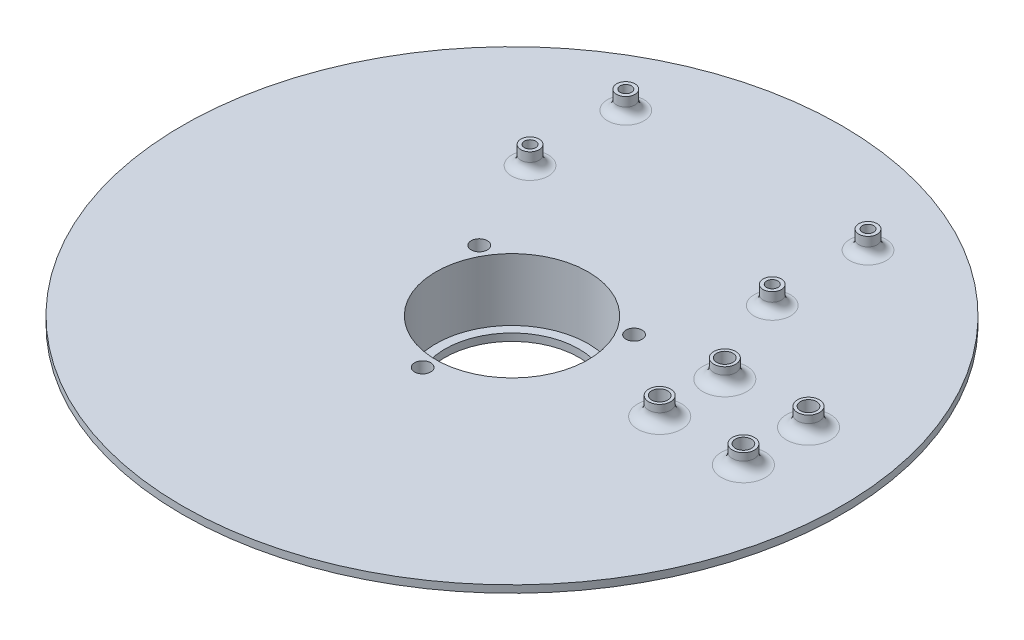
ISO-10303-21;
HEADER;
FILE_DESCRIPTION(('STEP AP214'),'2;1');
FILE_NAME('part.step','',(''),(''),'','','');
FILE_SCHEMA(('AUTOMOTIVE_DESIGN { 1 0 10303 214 1 1 1 1 }'));
ENDSEC;
DATA;
#1=APPLICATION_CONTEXT('core data for automotive mechanical design processes');
#2=APPLICATION_PROTOCOL_DEFINITION('international standard','automotive_design',2000,#1);
#3=PRODUCT_CONTEXT('',#1,'mechanical');
#4=PRODUCT('Part','Part','',(#3));
#5=PRODUCT_RELATED_PRODUCT_CATEGORY('part','',(#4));
#6=PRODUCT_DEFINITION_FORMATION('','',#4);
#7=PRODUCT_DEFINITION_CONTEXT('part definition',#1,'design');
#8=PRODUCT_DEFINITION('design','',#6,#7);
#9=PRODUCT_DEFINITION_SHAPE('','',#8);
#10=(LENGTH_UNIT() NAMED_UNIT(*) SI_UNIT(.MILLI.,.METRE.));
#11=(NAMED_UNIT(*) PLANE_ANGLE_UNIT() SI_UNIT($,.RADIAN.));
#12=(NAMED_UNIT(*) SI_UNIT($,.STERADIAN.) SOLID_ANGLE_UNIT());
#13=UNCERTAINTY_MEASURE_WITH_UNIT(LENGTH_MEASURE(1.E-05),#10,'distance_accuracy_value','');
#14=(GEOMETRIC_REPRESENTATION_CONTEXT(3) GLOBAL_UNCERTAINTY_ASSIGNED_CONTEXT((#13)) GLOBAL_UNIT_ASSIGNED_CONTEXT((#10,
#11,#12)) REPRESENTATION_CONTEXT('',''));
#15=CARTESIAN_POINT('',(0.,0.,0.));
#16=DIRECTION('',(0.,0.,1.));
#17=DIRECTION('',(1.,0.,0.));
#18=AXIS2_PLACEMENT_3D('',#15,#16,#17);
#19=CARTESIAN_POINT('',(0.,2.,0.));
#20=DIRECTION('',(0.,-1.,0.));
#21=DIRECTION('',(0.,0.,-1.));
#22=AXIS2_PLACEMENT_3D('',#19,#20,#21);
#23=CYLINDRICAL_SURFACE('',#22,20.8);
#24=CARTESIAN_POINT('',(0.,2.,0.));
#25=DIRECTION('',(0.,-1.,0.));
#26=DIRECTION('',(0.,0.,-1.));
#27=AXIS2_PLACEMENT_3D('',#24,#25,#26);
#28=CIRCLE('',#27,20.8);
#29=CARTESIAN_POINT('',(0.,2.,-20.8));
#30=VERTEX_POINT('',#29);
#31=EDGE_CURVE('E112',#30,#30,#28,.T.);
#32=ORIENTED_EDGE('',*,*,#31,.F.);
#33=EDGE_LOOP('',(#32));
#34=FACE_BOUND('',#33,.T.);
#35=CARTESIAN_POINT('',(0.,-15.,0.));
#36=DIRECTION('',(0.,-1.,0.));
#37=DIRECTION('',(0.,0.,-1.));
#38=AXIS2_PLACEMENT_3D('',#35,#36,#37);
#39=CIRCLE('',#38,20.8);
#40=CARTESIAN_POINT('',(0.,-15.,-20.8));
#41=VERTEX_POINT('',#40);
#42=EDGE_CURVE('E97',#41,#41,#39,.F.);
#43=ORIENTED_EDGE('',*,*,#42,.F.);
#44=EDGE_LOOP('',(#43));
#45=FACE_BOUND('',#44,.T.);
#46=ADVANCED_FACE('F41',(#34,#45),#23,.F.);
#47=CARTESIAN_POINT('',(0.,2.,0.));
#48=DIRECTION('',(0.,-1.,0.));
#49=DIRECTION('',(0.,0.,-1.));
#50=AXIS2_PLACEMENT_3D('',#47,#48,#49);
#51=CYLINDRICAL_SURFACE('',#50,90.);
#52=CARTESIAN_POINT('',(0.,2.,0.));
#53=DIRECTION('',(0.,1.,0.));
#54=DIRECTION('',(0.,0.,1.));
#55=AXIS2_PLACEMENT_3D('',#52,#53,#54);
#56=CIRCLE('',#55,90.);
#57=CARTESIAN_POINT('',(0.,2.,90.));
#58=VERTEX_POINT('',#57);
#59=EDGE_CURVE('E104',#58,#58,#56,.T.);
#60=ORIENTED_EDGE('',*,*,#59,.F.);
#61=EDGE_LOOP('',(#60));
#62=FACE_BOUND('',#61,.T.);
#63=CARTESIAN_POINT('',(0.,0.,0.));
#64=DIRECTION('',(0.,1.,0.));
#65=DIRECTION('',(0.,0.,1.));
#66=AXIS2_PLACEMENT_3D('',#63,#64,#65);
#67=CIRCLE('',#66,90.);
#68=CARTESIAN_POINT('',(0.,0.,90.));
#69=VERTEX_POINT('',#68);
#70=EDGE_CURVE('E101',#69,#69,#67,.T.);
#71=ORIENTED_EDGE('',*,*,#70,.T.);
#72=EDGE_LOOP('',(#71));
#73=FACE_BOUND('',#72,.T.);
#74=ADVANCED_FACE('F235',(#62,#73),#51,.T.);
#75=CARTESIAN_POINT('',(0.,2.,0.));
#76=DIRECTION('',(0.,1.,0.));
#77=DIRECTION('',(0.,0.,1.));
#78=AXIS2_PLACEMENT_3D('',#75,#76,#77);
#79=PLANE('',#78);
#80=CARTESIAN_POINT('',(66.86,2.,3.667));
#81=DIRECTION('',(0.,1.,0.));
#82=DIRECTION('',(0.,0.,1.));
#83=AXIS2_PLACEMENT_3D('',#80,#81,#82);
#84=CIRCLE('',#83,6.00000000000001);
#85=CARTESIAN_POINT('',(66.86,2.,9.66700000000001));
#86=VERTEX_POINT('',#85);
#87=EDGE_CURVE('E56',#86,#86,#84,.F.);
#88=ORIENTED_EDGE('',*,*,#87,.T.);
#89=EDGE_LOOP('',(#88));
#90=FACE_BOUND('',#89,.T.);
#91=CARTESIAN_POINT('',(66.86,2.,-14.113));
#92=DIRECTION('',(0.,1.,0.));
#93=DIRECTION('',(0.,0.,1.));
#94=AXIS2_PLACEMENT_3D('',#91,#92,#93);
#95=CIRCLE('',#94,6.00000000000001);
#96=CARTESIAN_POINT('',(66.86,2.,-8.113));
#97=VERTEX_POINT('',#96);
#98=EDGE_CURVE('E61',#97,#97,#95,.F.);
#99=ORIENTED_EDGE('',*,*,#98,.T.);
#100=EDGE_LOOP('',(#99));
#101=FACE_BOUND('',#100,.T.);
#102=CARTESIAN_POINT('',(44.,2.,-14.113));
#103=DIRECTION('',(0.,1.,0.));
#104=DIRECTION('',(0.,0.,1.));
#105=AXIS2_PLACEMENT_3D('',#102,#103,#104);
#106=CIRCLE('',#105,6.);
#107=CARTESIAN_POINT('',(44.,2.,-8.113));
#108=VERTEX_POINT('',#107);
#109=EDGE_CURVE('E64',#108,#108,#106,.F.);
#110=ORIENTED_EDGE('',*,*,#109,.T.);
#111=EDGE_LOOP('',(#110));
#112=FACE_BOUND('',#111,.T.);
#113=CARTESIAN_POINT('',(44.,2.,3.667));
#114=DIRECTION('',(0.,1.,0.));
#115=DIRECTION('',(0.,0.,1.));
#116=AXIS2_PLACEMENT_3D('',#113,#114,#115);
#117=CIRCLE('',#116,6.);
#118=CARTESIAN_POINT('',(44.,2.,9.667));
#119=VERTEX_POINT('',#118);
#120=EDGE_CURVE('E67',#119,#119,#117,.F.);
#121=ORIENTED_EDGE('',*,*,#120,.T.);
#122=EDGE_LOOP('',(#121));
#123=FACE_BOUND('',#122,.T.);
#124=CARTESIAN_POINT('',(-33.075,2.,-64.15));
#125=DIRECTION('',(0.,1.,0.));
#126=DIRECTION('',(0.,0.,1.));
#127=AXIS2_PLACEMENT_3D('',#124,#125,#126);
#128=CIRCLE('',#127,5.);
#129=CARTESIAN_POINT('',(-33.075,2.,-59.15));
#130=VERTEX_POINT('',#129);
#131=EDGE_CURVE('E82',#130,#130,#128,.F.);
#132=ORIENTED_EDGE('',*,*,#131,.T.);
#133=EDGE_LOOP('',(#132));
#134=FACE_BOUND('',#133,.T.);
#135=CARTESIAN_POINT('',(-33.075,2.,-38.));
#136=DIRECTION('',(0.,1.,0.));
#137=DIRECTION('',(0.,0.,1.));
#138=AXIS2_PLACEMENT_3D('',#135,#136,#137);
#139=CIRCLE('',#138,5.);
#140=CARTESIAN_POINT('',(-33.075,2.,-33.));
#141=VERTEX_POINT('',#140);
#142=EDGE_CURVE('E85',#141,#141,#139,.F.);
#143=ORIENTED_EDGE('',*,*,#142,.T.);
#144=EDGE_LOOP('',(#143));
#145=FACE_BOUND('',#144,.T.);
#146=CARTESIAN_POINT('',(33.075,2.,-64.15));
#147=DIRECTION('',(0.,1.,0.));
#148=DIRECTION('',(0.,0.,1.));
#149=AXIS2_PLACEMENT_3D('',#146,#147,#148);
#150=CIRCLE('',#149,5.);
#151=CARTESIAN_POINT('',(33.075,2.,-59.15));
#152=VERTEX_POINT('',#151);
#153=EDGE_CURVE('E88',#152,#152,#150,.F.);
#154=ORIENTED_EDGE('',*,*,#153,.T.);
#155=EDGE_LOOP('',(#154));
#156=FACE_BOUND('',#155,.T.);
#157=CARTESIAN_POINT('',(33.075,2.,-38.));
#158=DIRECTION('',(0.,1.,0.));
#159=DIRECTION('',(0.,0.,1.));
#160=AXIS2_PLACEMENT_3D('',#157,#158,#159);
#161=CIRCLE('',#160,5.);
#162=CARTESIAN_POINT('',(33.075,2.,-33.));
#163=VERTEX_POINT('',#162);
#164=EDGE_CURVE('E91',#163,#163,#161,.F.);
#165=ORIENTED_EDGE('',*,*,#164,.T.);
#166=EDGE_LOOP('',(#165));
#167=FACE_BOUND('',#166,.T.);
#168=CARTESIAN_POINT('',(0.,2.,24.4));
#169=DIRECTION('',(0.,1.,0.));
#170=DIRECTION('',(0.,0.,1.));
#171=AXIS2_PLACEMENT_3D('',#168,#169,#170);
#172=CIRCLE('',#171,2.2);
#173=CARTESIAN_POINT('',(0.,2.,26.6));
#174=VERTEX_POINT('',#173);
#175=EDGE_CURVE('E135',#174,#174,#172,.T.);
#176=ORIENTED_EDGE('',*,*,#175,.F.);
#177=EDGE_LOOP('',(#176));
#178=FACE_BOUND('',#177,.T.);
#179=CARTESIAN_POINT('',(-21.1310198523402,2.,-12.2000000000001));
#180=DIRECTION('',(0.,1.,0.));
#181=DIRECTION('',(0.,0.,1.));
#182=AXIS2_PLACEMENT_3D('',#179,#180,#181);
#183=CIRCLE('',#182,2.2);
#184=CARTESIAN_POINT('',(-21.1310198523402,2.,-10.0000000000001));
#185=VERTEX_POINT('',#184);
#186=EDGE_CURVE('E132',#185,#185,#183,.T.);
#187=ORIENTED_EDGE('',*,*,#186,.F.);
#188=EDGE_LOOP('',(#187));
#189=FACE_BOUND('',#188,.T.);
#190=CARTESIAN_POINT('',(21.1310198523404,2.,-12.1999999999998));
#191=DIRECTION('',(0.,1.,0.));
#192=DIRECTION('',(0.,0.,1.));
#193=AXIS2_PLACEMENT_3D('',#190,#191,#192);
#194=CIRCLE('',#193,2.2);
#195=CARTESIAN_POINT('',(21.1310198523404,2.,-9.9999999999998));
#196=VERTEX_POINT('',#195);
#197=EDGE_CURVE('E125',#196,#196,#194,.T.);
#198=ORIENTED_EDGE('',*,*,#197,.F.);
#199=EDGE_LOOP('',(#198));
#200=FACE_BOUND('',#199,.T.);
#201=ORIENTED_EDGE('',*,*,#31,.T.);
#202=EDGE_LOOP('',(#201));
#203=FACE_BOUND('',#202,.T.);
#204=ORIENTED_EDGE('',*,*,#59,.T.);
#205=EDGE_LOOP('',(#204));
#206=FACE_BOUND('',#205,.T.);
#207=ADVANCED_FACE('F243',(#90,#101,#112,#123,#134,#145,#156,#167,#178,#189,#200,#203,#206),#79,.T.);
#208=CARTESIAN_POINT('',(0.,0.,0.));
#209=DIRECTION('',(0.,1.,0.));
#210=DIRECTION('',(0.,0.,1.));
#211=AXIS2_PLACEMENT_3D('',#208,#209,#210);
#212=PLANE('',#211);
#213=CARTESIAN_POINT('',(0.,0.,0.));
#214=DIRECTION('',(0.,-1.,0.));
#215=DIRECTION('',(0.,0.,-1.));
#216=AXIS2_PLACEMENT_3D('',#213,#214,#215);
#217=CIRCLE('',#216,28.);
#218=CARTESIAN_POINT('',(0.,0.,-28.));
#219=VERTEX_POINT('',#218);
#220=EDGE_CURVE('E100',#219,#219,#217,.T.);
#221=ORIENTED_EDGE('',*,*,#220,.F.);
#222=EDGE_LOOP('',(#221));
#223=FACE_BOUND('',#222,.T.);
#224=ORIENTED_EDGE('',*,*,#70,.F.);
#225=EDGE_LOOP('',(#224));
#226=FACE_BOUND('',#225,.T.);
#227=ADVANCED_FACE('F258',(#223,#226),#212,.F.);
#228=CARTESIAN_POINT('',(0.,-17.,0.));
#229=DIRECTION('',(0.,1.,0.));
#230=DIRECTION('',(0.,0.,1.));
#231=AXIS2_PLACEMENT_3D('',#228,#229,#230);
#232=CYLINDRICAL_SURFACE('',#231,28.);
#233=CARTESIAN_POINT('',(0.,-17.,0.));
#234=DIRECTION('',(0.,-1.,0.));
#235=DIRECTION('',(0.,0.,-1.));
#236=AXIS2_PLACEMENT_3D('',#233,#234,#235);
#237=CIRCLE('',#236,28.);
#238=CARTESIAN_POINT('',(0.,-17.,-28.));
#239=VERTEX_POINT('',#238);
#240=EDGE_CURVE('E105',#239,#239,#237,.T.);
#241=ORIENTED_EDGE('',*,*,#240,.F.);
#242=EDGE_LOOP('',(#241));
#243=FACE_BOUND('',#242,.T.);
#244=ORIENTED_EDGE('',*,*,#220,.T.);
#245=EDGE_LOOP('',(#244));
#246=FACE_BOUND('',#245,.T.);
#247=ADVANCED_FACE('F255',(#243,#246),#232,.T.);
#248=CARTESIAN_POINT('',(0.,-17.,0.));
#249=DIRECTION('',(0.,-1.,0.));
#250=DIRECTION('',(0.,0.,-1.));
#251=AXIS2_PLACEMENT_3D('',#248,#249,#250);
#252=PLANE('',#251);
#253=CARTESIAN_POINT('',(0.,-17.,0.));
#254=DIRECTION('',(0.,-1.,0.));
#255=DIRECTION('',(0.,0.,-1.));
#256=AXIS2_PLACEMENT_3D('',#253,#254,#255);
#257=CIRCLE('',#256,18.3);
#258=CARTESIAN_POINT('',(0.,-17.,-18.3));
#259=VERTEX_POINT('',#258);
#260=EDGE_CURVE('E116',#259,#259,#257,.T.);
#261=ORIENTED_EDGE('',*,*,#260,.F.);
#262=EDGE_LOOP('',(#261));
#263=FACE_BOUND('',#262,.T.);
#264=ORIENTED_EDGE('',*,*,#240,.T.);
#265=EDGE_LOOP('',(#264));
#266=FACE_BOUND('',#265,.T.);
#267=ADVANCED_FACE('F252',(#263,#266),#252,.T.);
#268=CARTESIAN_POINT('',(0.,-15.,0.));
#269=DIRECTION('',(0.,-1.,0.));
#270=DIRECTION('',(0.,0.,-1.));
#271=AXIS2_PLACEMENT_3D('',#268,#269,#270);
#272=PLANE('',#271);
#273=CARTESIAN_POINT('',(0.,-15.,0.));
#274=DIRECTION('',(0.,-1.,0.));
#275=DIRECTION('',(0.,0.,-1.));
#276=AXIS2_PLACEMENT_3D('',#273,#274,#275);
#277=CIRCLE('',#276,18.3);
#278=CARTESIAN_POINT('',(0.,-15.,-18.3));
#279=VERTEX_POINT('',#278);
#280=EDGE_CURVE('E115',#279,#279,#277,.T.);
#281=ORIENTED_EDGE('',*,*,#280,.T.);
#282=EDGE_LOOP('',(#281));
#283=FACE_BOUND('',#282,.T.);
#284=ORIENTED_EDGE('',*,*,#42,.T.);
#285=EDGE_LOOP('',(#284));
#286=FACE_BOUND('',#285,.T.);
#287=ADVANCED_FACE('F250',(#283,#286),#272,.F.);
#288=CARTESIAN_POINT('',(0.,-15.,0.));
#289=DIRECTION('',(0.,-1.,0.));
#290=DIRECTION('',(0.,0.,-1.));
#291=AXIS2_PLACEMENT_3D('',#288,#289,#290);
#292=CYLINDRICAL_SURFACE('',#291,18.3);
#293=ORIENTED_EDGE('',*,*,#280,.F.);
#294=EDGE_LOOP('',(#293));
#295=FACE_BOUND('',#294,.T.);
#296=ORIENTED_EDGE('',*,*,#260,.T.);
#297=EDGE_LOOP('',(#296));
#298=FACE_BOUND('',#297,.T.);
#299=ADVANCED_FACE('F326',(#295,#298),#292,.F.);
#300=CARTESIAN_POINT('',(21.1310198523404,-4.,-12.1999999999998));
#301=DIRECTION('',(0.,1.,0.));
#302=DIRECTION('',(0.,0.,1.));
#303=AXIS2_PLACEMENT_3D('',#300,#301,#302);
#304=CYLINDRICAL_SURFACE('',#303,2.2);
#305=CARTESIAN_POINT('',(21.1310198523404,-4.,-12.1999999999998));
#306=DIRECTION('',(0.,1.,0.));
#307=DIRECTION('',(0.,0.,1.));
#308=AXIS2_PLACEMENT_3D('',#305,#306,#307);
#309=CIRCLE('',#308,2.2);
#310=CARTESIAN_POINT('',(21.1310198523404,-4.,-9.9999999999998));
#311=VERTEX_POINT('',#310);
#312=EDGE_CURVE('E122',#311,#311,#309,.T.);
#313=ORIENTED_EDGE('',*,*,#312,.F.);
#314=EDGE_LOOP('',(#313));
#315=FACE_BOUND('',#314,.T.);
#316=ORIENTED_EDGE('',*,*,#197,.T.);
#317=EDGE_LOOP('',(#316));
#318=FACE_BOUND('',#317,.T.);
#319=ADVANCED_FACE('F323',(#315,#318),#304,.F.);
#320=CARTESIAN_POINT('',(21.1310198523404,-4.,-12.1999999999998));
#321=DIRECTION('',(0.,1.,0.));
#322=DIRECTION('',(0.,0.,1.));
#323=AXIS2_PLACEMENT_3D('',#320,#321,#322);
#324=PLANE('',#323);
#325=ORIENTED_EDGE('',*,*,#312,.T.);
#326=EDGE_LOOP('',(#325));
#327=FACE_BOUND('',#326,.T.);
#328=ADVANCED_FACE('F325',(#327),#324,.T.);
#329=CARTESIAN_POINT('',(-21.1310198523402,-4.,-12.2000000000001));
#330=DIRECTION('',(0.,1.,0.));
#331=DIRECTION('',(0.,0.,1.));
#332=AXIS2_PLACEMENT_3D('',#329,#330,#331);
#333=CYLINDRICAL_SURFACE('',#332,2.2);
#334=CARTESIAN_POINT('',(-21.1310198523402,-4.,-12.2000000000001));
#335=DIRECTION('',(0.,1.,0.));
#336=DIRECTION('',(0.,0.,1.));
#337=AXIS2_PLACEMENT_3D('',#334,#335,#336);
#338=CIRCLE('',#337,2.2);
#339=CARTESIAN_POINT('',(-21.1310198523402,-4.,-10.0000000000001));
#340=VERTEX_POINT('',#339);
#341=EDGE_CURVE('E129',#340,#340,#338,.T.);
#342=ORIENTED_EDGE('',*,*,#341,.F.);
#343=EDGE_LOOP('',(#342));
#344=FACE_BOUND('',#343,.T.);
#345=ORIENTED_EDGE('',*,*,#186,.T.);
#346=EDGE_LOOP('',(#345));
#347=FACE_BOUND('',#346,.T.);
#348=ADVANCED_FACE('F333',(#344,#347),#333,.F.);
#349=CARTESIAN_POINT('',(-21.1310198523402,-4.,-12.2000000000001));
#350=DIRECTION('',(0.,1.,0.));
#351=DIRECTION('',(0.,0.,1.));
#352=AXIS2_PLACEMENT_3D('',#349,#350,#351);
#353=PLANE('',#352);
#354=ORIENTED_EDGE('',*,*,#341,.T.);
#355=EDGE_LOOP('',(#354));
#356=FACE_BOUND('',#355,.T.);
#357=ADVANCED_FACE('F339',(#356),#353,.T.);
#358=CARTESIAN_POINT('',(0.,-4.,24.4));
#359=DIRECTION('',(0.,1.,0.));
#360=DIRECTION('',(0.,0.,1.));
#361=AXIS2_PLACEMENT_3D('',#358,#359,#360);
#362=CYLINDRICAL_SURFACE('',#361,2.2);
#363=CARTESIAN_POINT('',(0.,-4.,24.4));
#364=DIRECTION('',(0.,1.,0.));
#365=DIRECTION('',(0.,0.,1.));
#366=AXIS2_PLACEMENT_3D('',#363,#364,#365);
#367=CIRCLE('',#366,2.2);
#368=CARTESIAN_POINT('',(0.,-4.,26.6));
#369=VERTEX_POINT('',#368);
#370=EDGE_CURVE('E119',#369,#369,#367,.T.);
#371=ORIENTED_EDGE('',*,*,#370,.F.);
#372=EDGE_LOOP('',(#371));
#373=FACE_BOUND('',#372,.T.);
#374=ORIENTED_EDGE('',*,*,#175,.T.);
#375=EDGE_LOOP('',(#374));
#376=FACE_BOUND('',#375,.T.);
#377=ADVANCED_FACE('F342',(#373,#376),#362,.F.);
#378=CARTESIAN_POINT('',(0.,-4.,24.4));
#379=DIRECTION('',(0.,1.,0.));
#380=DIRECTION('',(0.,0.,1.));
#381=AXIS2_PLACEMENT_3D('',#378,#379,#380);
#382=PLANE('',#381);
#383=ORIENTED_EDGE('',*,*,#370,.T.);
#384=EDGE_LOOP('',(#383));
#385=FACE_BOUND('',#384,.T.);
#386=ADVANCED_FACE('F349',(#385),#382,.T.);
#387=CARTESIAN_POINT('',(-33.075,7.,-38.));
#388=DIRECTION('',(0.,-1.,0.));
#389=DIRECTION('',(0.,0.,-1.));
#390=AXIS2_PLACEMENT_3D('',#387,#388,#389);
#391=CYLINDRICAL_SURFACE('',#390,2.5);
#392=CARTESIAN_POINT('',(-33.075,4.5,-38.));
#393=DIRECTION('',(0.,1.,0.));
#394=DIRECTION('',(0.,0.,1.));
#395=AXIS2_PLACEMENT_3D('',#392,#393,#394);
#396=CIRCLE('',#395,2.5);
#397=CARTESIAN_POINT('',(-33.075,4.5,-35.5));
#398=VERTEX_POINT('',#397);
#399=EDGE_CURVE('E79',#398,#398,#396,.T.);
#400=ORIENTED_EDGE('',*,*,#399,.T.);
#401=EDGE_LOOP('',(#400));
#402=FACE_BOUND('',#401,.T.);
#403=CARTESIAN_POINT('',(-33.075,7.,-38.));
#404=DIRECTION('',(0.,1.,0.));
#405=DIRECTION('',(0.,0.,1.));
#406=AXIS2_PLACEMENT_3D('',#403,#404,#405);
#407=CIRCLE('',#406,2.5);
#408=CARTESIAN_POINT('',(-33.075,7.,-35.5));
#409=VERTEX_POINT('',#408);
#410=EDGE_CURVE('E126',#409,#409,#407,.T.);
#411=ORIENTED_EDGE('',*,*,#410,.F.);
#412=EDGE_LOOP('',(#411));
#413=FACE_BOUND('',#412,.T.);
#414=ADVANCED_FACE('F353',(#402,#413),#391,.T.);
#415=CARTESIAN_POINT('',(-33.075,7.,-38.));
#416=DIRECTION('',(0.,1.,0.));
#417=DIRECTION('',(0.,0.,1.));
#418=AXIS2_PLACEMENT_3D('',#415,#416,#417);
#419=PLANE('',#418);
#420=CARTESIAN_POINT('',(-33.075,7.,-38.));
#421=DIRECTION('',(0.,1.,0.));
#422=DIRECTION('',(0.,0.,1.));
#423=AXIS2_PLACEMENT_3D('',#420,#421,#422);
#424=CIRCLE('',#423,1.55);
#425=CARTESIAN_POINT('',(-33.075,7.,-36.45));
#426=VERTEX_POINT('',#425);
#427=EDGE_CURVE('E152',#426,#426,#424,.T.);
#428=ORIENTED_EDGE('',*,*,#427,.F.);
#429=EDGE_LOOP('',(#428));
#430=FACE_BOUND('',#429,.T.);
#431=ORIENTED_EDGE('',*,*,#410,.T.);
#432=EDGE_LOOP('',(#431));
#433=FACE_BOUND('',#432,.T.);
#434=ADVANCED_FACE('F357',(#430,#433),#419,.T.);
#435=CARTESIAN_POINT('',(-33.075,7.,-64.15));
#436=DIRECTION('',(0.,-1.,0.));
#437=DIRECTION('',(0.,0.,-1.));
#438=AXIS2_PLACEMENT_3D('',#435,#436,#437);
#439=CYLINDRICAL_SURFACE('',#438,2.5);
#440=CARTESIAN_POINT('',(-33.075,4.5,-64.15));
#441=DIRECTION('',(0.,1.,0.));
#442=DIRECTION('',(0.,0.,1.));
#443=AXIS2_PLACEMENT_3D('',#440,#441,#442);
#444=CIRCLE('',#443,2.5);
#445=CARTESIAN_POINT('',(-33.075,4.5,-61.65));
#446=VERTEX_POINT('',#445);
#447=EDGE_CURVE('E94',#446,#446,#444,.T.);
#448=ORIENTED_EDGE('',*,*,#447,.T.);
#449=EDGE_LOOP('',(#448));
#450=FACE_BOUND('',#449,.T.);
#451=CARTESIAN_POINT('',(-33.075,7.,-64.15));
#452=DIRECTION('',(0.,1.,0.));
#453=DIRECTION('',(0.,0.,1.));
#454=AXIS2_PLACEMENT_3D('',#451,#452,#453);
#455=CIRCLE('',#454,2.5);
#456=CARTESIAN_POINT('',(-33.075,7.,-61.65));
#457=VERTEX_POINT('',#456);
#458=EDGE_CURVE('E142',#457,#457,#455,.T.);
#459=ORIENTED_EDGE('',*,*,#458,.F.);
#460=EDGE_LOOP('',(#459));
#461=FACE_BOUND('',#460,.T.);
#462=ADVANCED_FACE('F361',(#450,#461),#439,.T.);
#463=CARTESIAN_POINT('',(-33.075,7.,-64.15));
#464=DIRECTION('',(0.,1.,0.));
#465=DIRECTION('',(0.,0.,1.));
#466=AXIS2_PLACEMENT_3D('',#463,#464,#465);
#467=PLANE('',#466);
#468=CARTESIAN_POINT('',(-33.075,7.,-64.15));
#469=DIRECTION('',(0.,1.,0.));
#470=DIRECTION('',(0.,0.,1.));
#471=AXIS2_PLACEMENT_3D('',#468,#469,#470);
#472=CIRCLE('',#471,1.55);
#473=CARTESIAN_POINT('',(-33.075,7.,-62.6));
#474=VERTEX_POINT('',#473);
#475=EDGE_CURVE('E155',#474,#474,#472,.T.);
#476=ORIENTED_EDGE('',*,*,#475,.F.);
#477=EDGE_LOOP('',(#476));
#478=FACE_BOUND('',#477,.T.);
#479=ORIENTED_EDGE('',*,*,#458,.T.);
#480=EDGE_LOOP('',(#479));
#481=FACE_BOUND('',#480,.T.);
#482=ADVANCED_FACE('F363',(#478,#481),#467,.T.);
#483=CARTESIAN_POINT('',(33.075,7.,-64.15));
#484=DIRECTION('',(0.,-1.,0.));
#485=DIRECTION('',(0.,0.,-1.));
#486=AXIS2_PLACEMENT_3D('',#483,#484,#485);
#487=CYLINDRICAL_SURFACE('',#486,2.5);
#488=CARTESIAN_POINT('',(33.075,4.5,-64.15));
#489=DIRECTION('',(0.,1.,0.));
#490=DIRECTION('',(0.,0.,1.));
#491=AXIS2_PLACEMENT_3D('',#488,#489,#490);
#492=CIRCLE('',#491,2.5);
#493=CARTESIAN_POINT('',(33.075,4.5,-61.65));
#494=VERTEX_POINT('',#493);
#495=EDGE_CURVE('E76',#494,#494,#492,.T.);
#496=ORIENTED_EDGE('',*,*,#495,.T.);
#497=EDGE_LOOP('',(#496));
#498=FACE_BOUND('',#497,.T.);
#499=CARTESIAN_POINT('',(33.075,7.,-64.15));
#500=DIRECTION('',(0.,1.,0.));
#501=DIRECTION('',(0.,0.,-1.));
#502=AXIS2_PLACEMENT_3D('',#499,#500,#501);
#503=CIRCLE('',#502,2.5);
#504=CARTESIAN_POINT('',(33.075,7.,-66.65));
#505=VERTEX_POINT('',#504);
#506=EDGE_CURVE('E145',#505,#505,#503,.T.);
#507=ORIENTED_EDGE('',*,*,#506,.F.);
#508=EDGE_LOOP('',(#507));
#509=FACE_BOUND('',#508,.T.);
#510=ADVANCED_FACE('F366',(#498,#509),#487,.T.);
#511=CARTESIAN_POINT('',(33.075,7.,-64.15));
#512=DIRECTION('',(0.,-1.,0.));
#513=DIRECTION('',(0.,0.,-1.));
#514=AXIS2_PLACEMENT_3D('',#511,#512,#513);
#515=PLANE('',#514);
#516=CARTESIAN_POINT('',(33.075,7.,-64.1499999999999));
#517=DIRECTION('',(0.,1.,0.));
#518=DIRECTION('',(0.,0.,-1.));
#519=AXIS2_PLACEMENT_3D('',#516,#517,#518);
#520=CIRCLE('',#519,1.55);
#521=CARTESIAN_POINT('',(33.075,7.,-65.6999999999999));
#522=VERTEX_POINT('',#521);
#523=EDGE_CURVE('E162',#522,#522,#520,.T.);
#524=ORIENTED_EDGE('',*,*,#523,.F.);
#525=EDGE_LOOP('',(#524));
#526=FACE_BOUND('',#525,.T.);
#527=ORIENTED_EDGE('',*,*,#506,.T.);
#528=EDGE_LOOP('',(#527));
#529=FACE_BOUND('',#528,.T.);
#530=ADVANCED_FACE('F371',(#526,#529),#515,.F.);
#531=CARTESIAN_POINT('',(33.075,7.,-38.));
#532=DIRECTION('',(0.,-1.,0.));
#533=DIRECTION('',(0.,0.,-1.));
#534=AXIS2_PLACEMENT_3D('',#531,#532,#533);
#535=CYLINDRICAL_SURFACE('',#534,2.5);
#536=CARTESIAN_POINT('',(33.075,4.5,-38.));
#537=DIRECTION('',(0.,1.,0.));
#538=DIRECTION('',(0.,0.,1.));
#539=AXIS2_PLACEMENT_3D('',#536,#537,#538);
#540=CIRCLE('',#539,2.5);
#541=CARTESIAN_POINT('',(33.075,4.5,-35.5));
#542=VERTEX_POINT('',#541);
#543=EDGE_CURVE('E73',#542,#542,#540,.T.);
#544=ORIENTED_EDGE('',*,*,#543,.T.);
#545=EDGE_LOOP('',(#544));
#546=FACE_BOUND('',#545,.T.);
#547=CARTESIAN_POINT('',(33.075,7.,-38.));
#548=DIRECTION('',(0.,1.,0.));
#549=DIRECTION('',(0.,0.,-1.));
#550=AXIS2_PLACEMENT_3D('',#547,#548,#549);
#551=CIRCLE('',#550,2.5);
#552=CARTESIAN_POINT('',(33.075,7.,-40.5));
#553=VERTEX_POINT('',#552);
#554=EDGE_CURVE('E148',#553,#553,#551,.T.);
#555=ORIENTED_EDGE('',*,*,#554,.F.);
#556=EDGE_LOOP('',(#555));
#557=FACE_BOUND('',#556,.T.);
#558=ADVANCED_FACE('F374',(#546,#557),#535,.T.);
#559=CARTESIAN_POINT('',(33.075,7.,-38.));
#560=DIRECTION('',(0.,-1.,0.));
#561=DIRECTION('',(0.,0.,-1.));
#562=AXIS2_PLACEMENT_3D('',#559,#560,#561);
#563=PLANE('',#562);
#564=CARTESIAN_POINT('',(33.075,7.,-38.));
#565=DIRECTION('',(0.,1.,0.));
#566=DIRECTION('',(0.,0.,-1.));
#567=AXIS2_PLACEMENT_3D('',#564,#565,#566);
#568=CIRCLE('',#567,1.55);
#569=CARTESIAN_POINT('',(33.075,7.,-39.55));
#570=VERTEX_POINT('',#569);
#571=EDGE_CURVE('E161',#570,#570,#568,.T.);
#572=ORIENTED_EDGE('',*,*,#571,.F.);
#573=EDGE_LOOP('',(#572));
#574=FACE_BOUND('',#573,.T.);
#575=ORIENTED_EDGE('',*,*,#554,.T.);
#576=EDGE_LOOP('',(#575));
#577=FACE_BOUND('',#576,.T.);
#578=ADVANCED_FACE('F379',(#574,#577),#563,.F.);
#579=CARTESIAN_POINT('',(33.075,2.,-38.));
#580=DIRECTION('',(0.,1.,0.));
#581=DIRECTION('',(0.,0.,1.));
#582=AXIS2_PLACEMENT_3D('',#579,#580,#581);
#583=CYLINDRICAL_SURFACE('',#582,1.55);
#584=CARTESIAN_POINT('',(33.075,2.,-38.));
#585=DIRECTION('',(0.,1.,0.));
#586=DIRECTION('',(0.,0.,-1.));
#587=AXIS2_PLACEMENT_3D('',#584,#585,#586);
#588=CIRCLE('',#587,1.55);
#589=CARTESIAN_POINT('',(33.075,2.,-39.55));
#590=VERTEX_POINT('',#589);
#591=EDGE_CURVE('E158',#590,#590,#588,.T.);
#592=ORIENTED_EDGE('',*,*,#591,.F.);
#593=EDGE_LOOP('',(#592));
#594=FACE_BOUND('',#593,.T.);
#595=ORIENTED_EDGE('',*,*,#571,.T.);
#596=EDGE_LOOP('',(#595));
#597=FACE_BOUND('',#596,.T.);
#598=ADVANCED_FACE('F382',(#594,#597),#583,.F.);
#599=CARTESIAN_POINT('',(33.075,2.,-38.));
#600=DIRECTION('',(0.,-1.,0.));
#601=DIRECTION('',(0.,0.,-1.));
#602=AXIS2_PLACEMENT_3D('',#599,#600,#601);
#603=PLANE('',#602);
#604=ORIENTED_EDGE('',*,*,#591,.T.);
#605=EDGE_LOOP('',(#604));
#606=FACE_BOUND('',#605,.T.);
#607=ADVANCED_FACE('F395',(#606),#603,.F.);
#608=CARTESIAN_POINT('',(33.075,2.,-64.1499999999999));
#609=DIRECTION('',(0.,1.,0.));
#610=DIRECTION('',(0.,0.,1.));
#611=AXIS2_PLACEMENT_3D('',#608,#609,#610);
#612=CYLINDRICAL_SURFACE('',#611,1.55);
#613=CARTESIAN_POINT('',(33.075,2.,-64.1499999999999));
#614=DIRECTION('',(0.,1.,0.));
#615=DIRECTION('',(0.,0.,-1.));
#616=AXIS2_PLACEMENT_3D('',#613,#614,#615);
#617=CIRCLE('',#616,1.55);
#618=CARTESIAN_POINT('',(33.075,2.,-65.6999999999999));
#619=VERTEX_POINT('',#618);
#620=EDGE_CURVE('E170',#619,#619,#617,.T.);
#621=ORIENTED_EDGE('',*,*,#620,.F.);
#622=EDGE_LOOP('',(#621));
#623=FACE_BOUND('',#622,.T.);
#624=ORIENTED_EDGE('',*,*,#523,.T.);
#625=EDGE_LOOP('',(#624));
#626=FACE_BOUND('',#625,.T.);
#627=ADVANCED_FACE('F398',(#623,#626),#612,.F.);
#628=CARTESIAN_POINT('',(33.075,2.,-64.1499999999999));
#629=DIRECTION('',(0.,-1.,0.));
#630=DIRECTION('',(0.,0.,-1.));
#631=AXIS2_PLACEMENT_3D('',#628,#629,#630);
#632=PLANE('',#631);
#633=ORIENTED_EDGE('',*,*,#620,.T.);
#634=EDGE_LOOP('',(#633));
#635=FACE_BOUND('',#634,.T.);
#636=ADVANCED_FACE('F409',(#635),#632,.F.);
#637=CARTESIAN_POINT('',(-33.075,2.,-64.15));
#638=DIRECTION('',(0.,1.,0.));
#639=DIRECTION('',(0.,0.,1.));
#640=AXIS2_PLACEMENT_3D('',#637,#638,#639);
#641=CYLINDRICAL_SURFACE('',#640,1.55);
#642=CARTESIAN_POINT('',(-33.075,2.,-64.15));
#643=DIRECTION('',(0.,1.,0.));
#644=DIRECTION('',(0.,0.,1.));
#645=AXIS2_PLACEMENT_3D('',#642,#643,#644);
#646=CIRCLE('',#645,1.55);
#647=CARTESIAN_POINT('',(-33.075,2.,-62.6));
#648=VERTEX_POINT('',#647);
#649=EDGE_CURVE('E165',#648,#648,#646,.T.);
#650=ORIENTED_EDGE('',*,*,#649,.F.);
#651=EDGE_LOOP('',(#650));
#652=FACE_BOUND('',#651,.T.);
#653=ORIENTED_EDGE('',*,*,#475,.T.);
#654=EDGE_LOOP('',(#653));
#655=FACE_BOUND('',#654,.T.);
#656=ADVANCED_FACE('F405',(#652,#655),#641,.F.);
#657=CARTESIAN_POINT('',(-33.075,2.,-64.15));
#658=DIRECTION('',(0.,1.,0.));
#659=DIRECTION('',(0.,0.,1.));
#660=AXIS2_PLACEMENT_3D('',#657,#658,#659);
#661=PLANE('',#660);
#662=ORIENTED_EDGE('',*,*,#649,.T.);
#663=EDGE_LOOP('',(#662));
#664=FACE_BOUND('',#663,.T.);
#665=ADVANCED_FACE('F390',(#664),#661,.T.);
#666=CARTESIAN_POINT('',(-33.075,2.,-38.));
#667=DIRECTION('',(0.,1.,0.));
#668=DIRECTION('',(0.,0.,1.));
#669=AXIS2_PLACEMENT_3D('',#666,#667,#668);
#670=CYLINDRICAL_SURFACE('',#669,1.55);
#671=CARTESIAN_POINT('',(-33.075,2.,-38.));
#672=DIRECTION('',(0.,1.,0.));
#673=DIRECTION('',(0.,0.,1.));
#674=AXIS2_PLACEMENT_3D('',#671,#672,#673);
#675=CIRCLE('',#674,1.55);
#676=CARTESIAN_POINT('',(-33.075,2.,-36.45));
#677=VERTEX_POINT('',#676);
#678=EDGE_CURVE('E151',#677,#677,#675,.T.);
#679=ORIENTED_EDGE('',*,*,#678,.F.);
#680=EDGE_LOOP('',(#679));
#681=FACE_BOUND('',#680,.T.);
#682=ORIENTED_EDGE('',*,*,#427,.T.);
#683=EDGE_LOOP('',(#682));
#684=FACE_BOUND('',#683,.T.);
#685=ADVANCED_FACE('F387',(#681,#684),#670,.F.);
#686=CARTESIAN_POINT('',(-33.075,2.,-38.));
#687=DIRECTION('',(0.,1.,0.));
#688=DIRECTION('',(0.,0.,1.));
#689=AXIS2_PLACEMENT_3D('',#686,#687,#688);
#690=PLANE('',#689);
#691=ORIENTED_EDGE('',*,*,#678,.T.);
#692=EDGE_LOOP('',(#691));
#693=FACE_BOUND('',#692,.T.);
#694=ADVANCED_FACE('F269',(#693),#690,.T.);
#695=CARTESIAN_POINT('',(-33.075,4.5,-64.15));
#696=DIRECTION('',(0.,1.,0.));
#697=DIRECTION('',(0.,0.,1.));
#698=AXIS2_PLACEMENT_3D('',#695,#696,#697);
#699=TOROIDAL_SURFACE('',#698,5.,2.5);
#700=ORIENTED_EDGE('',*,*,#131,.F.);
#701=EDGE_LOOP('',(#700));
#702=FACE_BOUND('',#701,.T.);
#703=ORIENTED_EDGE('',*,*,#447,.F.);
#704=EDGE_LOOP('',(#703));
#705=FACE_BOUND('',#704,.T.);
#706=ADVANCED_FACE('F265',(#702,#705),#699,.F.);
#707=CARTESIAN_POINT('',(-33.075,4.5,-38.));
#708=DIRECTION('',(0.,1.,0.));
#709=DIRECTION('',(0.,0.,1.));
#710=AXIS2_PLACEMENT_3D('',#707,#708,#709);
#711=TOROIDAL_SURFACE('',#710,5.,2.5);
#712=ORIENTED_EDGE('',*,*,#142,.F.);
#713=EDGE_LOOP('',(#712));
#714=FACE_BOUND('',#713,.T.);
#715=ORIENTED_EDGE('',*,*,#399,.F.);
#716=EDGE_LOOP('',(#715));
#717=FACE_BOUND('',#716,.T.);
#718=ADVANCED_FACE('F268',(#714,#717),#711,.F.);
#719=CARTESIAN_POINT('',(33.075,4.5,-64.15));
#720=DIRECTION('',(0.,1.,0.));
#721=DIRECTION('',(0.,0.,1.));
#722=AXIS2_PLACEMENT_3D('',#719,#720,#721);
#723=TOROIDAL_SURFACE('',#722,5.,2.5);
#724=ORIENTED_EDGE('',*,*,#153,.F.);
#725=EDGE_LOOP('',(#724));
#726=FACE_BOUND('',#725,.T.);
#727=ORIENTED_EDGE('',*,*,#495,.F.);
#728=EDGE_LOOP('',(#727));
#729=FACE_BOUND('',#728,.T.);
#730=ADVANCED_FACE('F273',(#726,#729),#723,.F.);
#731=CARTESIAN_POINT('',(33.075,4.5,-38.));
#732=DIRECTION('',(0.,1.,0.));
#733=DIRECTION('',(0.,0.,1.));
#734=AXIS2_PLACEMENT_3D('',#731,#732,#733);
#735=TOROIDAL_SURFACE('',#734,5.,2.5);
#736=ORIENTED_EDGE('',*,*,#164,.F.);
#737=EDGE_LOOP('',(#736));
#738=FACE_BOUND('',#737,.T.);
#739=ORIENTED_EDGE('',*,*,#543,.F.);
#740=EDGE_LOOP('',(#739));
#741=FACE_BOUND('',#740,.T.);
#742=ADVANCED_FACE('F277',(#738,#741),#735,.F.);
#743=CARTESIAN_POINT('',(44.,7.,3.667));
#744=DIRECTION('',(0.,-1.,0.));
#745=DIRECTION('',(0.,0.,-1.));
#746=AXIS2_PLACEMENT_3D('',#743,#744,#745);
#747=CYLINDRICAL_SURFACE('',#746,3.);
#748=CARTESIAN_POINT('',(44.,5.,3.667));
#749=DIRECTION('',(0.,1.,0.));
#750=DIRECTION('',(0.,0.,1.));
#751=AXIS2_PLACEMENT_3D('',#748,#749,#750);
#752=CIRCLE('',#751,3.);
#753=CARTESIAN_POINT('',(44.,5.,6.667));
#754=VERTEX_POINT('',#753);
#755=EDGE_CURVE('E10',#754,#754,#752,.T.);
#756=ORIENTED_EDGE('',*,*,#755,.T.);
#757=EDGE_LOOP('',(#756));
#758=FACE_BOUND('',#757,.T.);
#759=CARTESIAN_POINT('',(44.,7.,3.667));
#760=DIRECTION('',(0.,1.,0.));
#761=DIRECTION('',(0.,0.,1.));
#762=AXIS2_PLACEMENT_3D('',#759,#760,#761);
#763=CIRCLE('',#762,3.);
#764=CARTESIAN_POINT('',(44.,7.,6.667));
#765=VERTEX_POINT('',#764);
#766=EDGE_CURVE('E173',#765,#765,#763,.T.);
#767=ORIENTED_EDGE('',*,*,#766,.F.);
#768=EDGE_LOOP('',(#767));
#769=FACE_BOUND('',#768,.T.);
#770=ADVANCED_FACE('F230',(#758,#769),#747,.T.);
#771=CARTESIAN_POINT('',(44.,7.,3.667));
#772=DIRECTION('',(0.,1.,0.));
#773=DIRECTION('',(0.,0.,1.));
#774=AXIS2_PLACEMENT_3D('',#771,#772,#773);
#775=PLANE('',#774);
#776=CARTESIAN_POINT('',(44.,7.,3.667));
#777=DIRECTION('',(0.,1.,0.));
#778=DIRECTION('',(0.,0.,1.));
#779=AXIS2_PLACEMENT_3D('',#776,#777,#778);
#780=CIRCLE('',#779,2.2);
#781=CARTESIAN_POINT('',(44.,7.,5.867));
#782=VERTEX_POINT('',#781);
#783=EDGE_CURVE('E188',#782,#782,#780,.T.);
#784=ORIENTED_EDGE('',*,*,#783,.F.);
#785=EDGE_LOOP('',(#784));
#786=FACE_BOUND('',#785,.T.);
#787=ORIENTED_EDGE('',*,*,#766,.T.);
#788=EDGE_LOOP('',(#787));
#789=FACE_BOUND('',#788,.T.);
#790=ADVANCED_FACE('F223',(#786,#789),#775,.T.);
#791=CARTESIAN_POINT('',(44.,7.,-14.113));
#792=DIRECTION('',(0.,-1.,0.));
#793=DIRECTION('',(0.,0.,-1.));
#794=AXIS2_PLACEMENT_3D('',#791,#792,#793);
#795=CYLINDRICAL_SURFACE('',#794,3.);
#796=CARTESIAN_POINT('',(44.,5.,-14.113));
#797=DIRECTION('',(0.,1.,0.));
#798=DIRECTION('',(0.,0.,1.));
#799=AXIS2_PLACEMENT_3D('',#796,#797,#798);
#800=CIRCLE('',#799,3.);
#801=CARTESIAN_POINT('',(44.,5.,-11.113));
#802=VERTEX_POINT('',#801);
#803=EDGE_CURVE('E48',#802,#802,#800,.T.);
#804=ORIENTED_EDGE('',*,*,#803,.T.);
#805=EDGE_LOOP('',(#804));
#806=FACE_BOUND('',#805,.T.);
#807=CARTESIAN_POINT('',(44.,7.,-14.113));
#808=DIRECTION('',(0.,1.,0.));
#809=DIRECTION('',(0.,0.,1.));
#810=AXIS2_PLACEMENT_3D('',#807,#808,#809);
#811=CIRCLE('',#810,3.);
#812=CARTESIAN_POINT('',(44.,7.,-11.113));
#813=VERTEX_POINT('',#812);
#814=EDGE_CURVE('E178',#813,#813,#811,.T.);
#815=ORIENTED_EDGE('',*,*,#814,.F.);
#816=EDGE_LOOP('',(#815));
#817=FACE_BOUND('',#816,.T.);
#818=ADVANCED_FACE('F218',(#806,#817),#795,.T.);
#819=CARTESIAN_POINT('',(44.,7.,-14.113));
#820=DIRECTION('',(0.,1.,0.));
#821=DIRECTION('',(0.,0.,1.));
#822=AXIS2_PLACEMENT_3D('',#819,#820,#821);
#823=PLANE('',#822);
#824=CARTESIAN_POINT('',(44.,7.,-14.113));
#825=DIRECTION('',(0.,1.,0.));
#826=DIRECTION('',(0.,0.,1.));
#827=AXIS2_PLACEMENT_3D('',#824,#825,#826);
#828=CIRCLE('',#827,2.2);
#829=CARTESIAN_POINT('',(44.,7.,-11.913));
#830=VERTEX_POINT('',#829);
#831=EDGE_CURVE('E191',#830,#830,#828,.T.);
#832=ORIENTED_EDGE('',*,*,#831,.F.);
#833=EDGE_LOOP('',(#832));
#834=FACE_BOUND('',#833,.T.);
#835=ORIENTED_EDGE('',*,*,#814,.T.);
#836=EDGE_LOOP('',(#835));
#837=FACE_BOUND('',#836,.T.);
#838=ADVANCED_FACE('F214',(#834,#837),#823,.T.);
#839=CARTESIAN_POINT('',(66.86,7.,3.667));
#840=DIRECTION('',(0.,-1.,0.));
#841=DIRECTION('',(0.,0.,-1.));
#842=AXIS2_PLACEMENT_3D('',#839,#840,#841);
#843=CYLINDRICAL_SURFACE('',#842,3.00000000000001);
#844=CARTESIAN_POINT('',(66.86,5.,3.667));
#845=DIRECTION('',(0.,1.,0.));
#846=DIRECTION('',(0.,0.,1.));
#847=AXIS2_PLACEMENT_3D('',#844,#845,#846);
#848=CIRCLE('',#847,3.00000000000001);
#849=CARTESIAN_POINT('',(66.86,5.,6.667));
#850=VERTEX_POINT('',#849);
#851=EDGE_CURVE('E70',#850,#850,#848,.T.);
#852=ORIENTED_EDGE('',*,*,#851,.T.);
#853=EDGE_LOOP('',(#852));
#854=FACE_BOUND('',#853,.T.);
#855=CARTESIAN_POINT('',(66.86,7.,3.667));
#856=DIRECTION('',(0.,1.,0.));
#857=DIRECTION('',(0.,0.,-1.));
#858=AXIS2_PLACEMENT_3D('',#855,#856,#857);
#859=CIRCLE('',#858,3.00000000000001);
#860=CARTESIAN_POINT('',(66.86,7.,0.666999999999989));
#861=VERTEX_POINT('',#860);
#862=EDGE_CURVE('E181',#861,#861,#859,.T.);
#863=ORIENTED_EDGE('',*,*,#862,.F.);
#864=EDGE_LOOP('',(#863));
#865=FACE_BOUND('',#864,.T.);
#866=ADVANCED_FACE('F217',(#854,#865),#843,.T.);
#867=CARTESIAN_POINT('',(66.86,7.,3.667));
#868=DIRECTION('',(0.,-1.,0.));
#869=DIRECTION('',(0.,0.,-1.));
#870=AXIS2_PLACEMENT_3D('',#867,#868,#869);
#871=PLANE('',#870);
#872=CARTESIAN_POINT('',(66.86,7.,3.667));
#873=DIRECTION('',(0.,1.,0.));
#874=DIRECTION('',(0.,0.,1.));
#875=AXIS2_PLACEMENT_3D('',#872,#873,#874);
#876=CIRCLE('',#875,2.2);
#877=CARTESIAN_POINT('',(66.86,7.,5.867));
#878=VERTEX_POINT('',#877);
#879=EDGE_CURVE('E197',#878,#878,#876,.T.);
#880=ORIENTED_EDGE('',*,*,#879,.F.);
#881=EDGE_LOOP('',(#880));
#882=FACE_BOUND('',#881,.T.);
#883=ORIENTED_EDGE('',*,*,#862,.T.);
#884=EDGE_LOOP('',(#883));
#885=FACE_BOUND('',#884,.T.);
#886=ADVANCED_FACE('F517',(#882,#885),#871,.F.);
#887=CARTESIAN_POINT('',(66.86,7.,-14.113));
#888=DIRECTION('',(0.,-1.,0.));
#889=DIRECTION('',(0.,0.,-1.));
#890=AXIS2_PLACEMENT_3D('',#887,#888,#889);
#891=CYLINDRICAL_SURFACE('',#890,3.00000000000001);
#892=CARTESIAN_POINT('',(66.86,5.,-14.113));
#893=DIRECTION('',(0.,1.,0.));
#894=DIRECTION('',(0.,0.,1.));
#895=AXIS2_PLACEMENT_3D('',#892,#893,#894);
#896=CIRCLE('',#895,3.00000000000001);
#897=CARTESIAN_POINT('',(66.86,5.,-11.113));
#898=VERTEX_POINT('',#897);
#899=EDGE_CURVE('E52',#898,#898,#896,.T.);
#900=ORIENTED_EDGE('',*,*,#899,.T.);
#901=EDGE_LOOP('',(#900));
#902=FACE_BOUND('',#901,.T.);
#903=CARTESIAN_POINT('',(66.86,7.,-14.113));
#904=DIRECTION('',(0.,1.,0.));
#905=DIRECTION('',(0.,0.,-1.));
#906=AXIS2_PLACEMENT_3D('',#903,#904,#905);
#907=CIRCLE('',#906,3.00000000000001);
#908=CARTESIAN_POINT('',(66.86,7.,-17.113));
#909=VERTEX_POINT('',#908);
#910=EDGE_CURVE('E184',#909,#909,#907,.T.);
#911=ORIENTED_EDGE('',*,*,#910,.F.);
#912=EDGE_LOOP('',(#911));
#913=FACE_BOUND('',#912,.T.);
#914=ADVANCED_FACE('F510',(#902,#913),#891,.T.);
#915=CARTESIAN_POINT('',(66.86,7.,-14.113));
#916=DIRECTION('',(0.,-1.,0.));
#917=DIRECTION('',(0.,0.,-1.));
#918=AXIS2_PLACEMENT_3D('',#915,#916,#917);
#919=PLANE('',#918);
#920=CARTESIAN_POINT('',(66.86,7.,-14.113));
#921=DIRECTION('',(0.,1.,0.));
#922=DIRECTION('',(0.,0.,1.));
#923=AXIS2_PLACEMENT_3D('',#920,#921,#922);
#924=CIRCLE('',#923,2.2);
#925=CARTESIAN_POINT('',(66.86,7.,-11.913));
#926=VERTEX_POINT('',#925);
#927=EDGE_CURVE('E203',#926,#926,#924,.T.);
#928=ORIENTED_EDGE('',*,*,#927,.F.);
#929=EDGE_LOOP('',(#928));
#930=FACE_BOUND('',#929,.T.);
#931=ORIENTED_EDGE('',*,*,#910,.T.);
#932=EDGE_LOOP('',(#931));
#933=FACE_BOUND('',#932,.T.);
#934=ADVANCED_FACE('F501',(#930,#933),#919,.F.);
#935=CARTESIAN_POINT('',(66.86,2.,-14.113));
#936=DIRECTION('',(0.,1.,0.));
#937=DIRECTION('',(0.,0.,1.));
#938=AXIS2_PLACEMENT_3D('',#935,#936,#937);
#939=CYLINDRICAL_SURFACE('',#938,2.2);
#940=CARTESIAN_POINT('',(66.86,2.,-14.113));
#941=DIRECTION('',(0.,1.,0.));
#942=DIRECTION('',(0.,0.,1.));
#943=AXIS2_PLACEMENT_3D('',#940,#941,#942);
#944=CIRCLE('',#943,2.2);
#945=CARTESIAN_POINT('',(66.86,2.,-11.913));
#946=VERTEX_POINT('',#945);
#947=EDGE_CURVE('E200',#946,#946,#944,.T.);
#948=ORIENTED_EDGE('',*,*,#947,.F.);
#949=EDGE_LOOP('',(#948));
#950=FACE_BOUND('',#949,.T.);
#951=ORIENTED_EDGE('',*,*,#927,.T.);
#952=EDGE_LOOP('',(#951));
#953=FACE_BOUND('',#952,.T.);
#954=ADVANCED_FACE('F492',(#950,#953),#939,.F.);
#955=CARTESIAN_POINT('',(66.86,2.,-14.113));
#956=DIRECTION('',(0.,1.,0.));
#957=DIRECTION('',(0.,0.,1.));
#958=AXIS2_PLACEMENT_3D('',#955,#956,#957);
#959=PLANE('',#958);
#960=ORIENTED_EDGE('',*,*,#947,.T.);
#961=EDGE_LOOP('',(#960));
#962=FACE_BOUND('',#961,.T.);
#963=ADVANCED_FACE('F483',(#962),#959,.T.);
#964=CARTESIAN_POINT('',(66.86,2.,3.667));
#965=DIRECTION('',(0.,1.,0.));
#966=DIRECTION('',(0.,0.,1.));
#967=AXIS2_PLACEMENT_3D('',#964,#965,#966);
#968=CYLINDRICAL_SURFACE('',#967,2.2);
#969=CARTESIAN_POINT('',(66.86,2.,3.667));
#970=DIRECTION('',(0.,1.,0.));
#971=DIRECTION('',(0.,0.,1.));
#972=AXIS2_PLACEMENT_3D('',#969,#970,#971);
#973=CIRCLE('',#972,2.2);
#974=CARTESIAN_POINT('',(66.86,2.,5.867));
#975=VERTEX_POINT('',#974);
#976=EDGE_CURVE('E194',#975,#975,#973,.T.);
#977=ORIENTED_EDGE('',*,*,#976,.F.);
#978=EDGE_LOOP('',(#977));
#979=FACE_BOUND('',#978,.T.);
#980=ORIENTED_EDGE('',*,*,#879,.T.);
#981=EDGE_LOOP('',(#980));
#982=FACE_BOUND('',#981,.T.);
#983=ADVANCED_FACE('F474',(#979,#982),#968,.F.);
#984=CARTESIAN_POINT('',(66.86,2.,3.667));
#985=DIRECTION('',(0.,1.,0.));
#986=DIRECTION('',(0.,0.,1.));
#987=AXIS2_PLACEMENT_3D('',#984,#985,#986);
#988=PLANE('',#987);
#989=ORIENTED_EDGE('',*,*,#976,.T.);
#990=EDGE_LOOP('',(#989));
#991=FACE_BOUND('',#990,.T.);
#992=ADVANCED_FACE('F465',(#991),#988,.T.);
#993=CARTESIAN_POINT('',(44.,2.,-14.113));
#994=DIRECTION('',(0.,1.,0.));
#995=DIRECTION('',(0.,0.,1.));
#996=AXIS2_PLACEMENT_3D('',#993,#994,#995);
#997=CYLINDRICAL_SURFACE('',#996,2.2);
#998=CARTESIAN_POINT('',(44.,2.,-14.113));
#999=DIRECTION('',(0.,1.,0.));
#1000=DIRECTION('',(0.,0.,1.));
#1001=AXIS2_PLACEMENT_3D('',#998,#999,#1000);
#1002=CIRCLE('',#1001,2.2);
#1003=CARTESIAN_POINT('',(44.,2.,-11.913));
#1004=VERTEX_POINT('',#1003);
#1005=EDGE_CURVE('E206',#1004,#1004,#1002,.T.);
#1006=ORIENTED_EDGE('',*,*,#1005,.F.);
#1007=EDGE_LOOP('',(#1006));
#1008=FACE_BOUND('',#1007,.T.);
#1009=ORIENTED_EDGE('',*,*,#831,.T.);
#1010=EDGE_LOOP('',(#1009));
#1011=FACE_BOUND('',#1010,.T.);
#1012=ADVANCED_FACE('F212',(#1008,#1011),#997,.F.);
#1013=CARTESIAN_POINT('',(44.,2.,-14.113));
#1014=DIRECTION('',(0.,1.,0.));
#1015=DIRECTION('',(0.,0.,1.));
#1016=AXIS2_PLACEMENT_3D('',#1013,#1014,#1015);
#1017=PLANE('',#1016);
#1018=ORIENTED_EDGE('',*,*,#1005,.T.);
#1019=EDGE_LOOP('',(#1018));
#1020=FACE_BOUND('',#1019,.T.);
#1021=ADVANCED_FACE('F448',(#1020),#1017,.T.);
#1022=CARTESIAN_POINT('',(44.,2.,3.667));
#1023=DIRECTION('',(0.,1.,0.));
#1024=DIRECTION('',(0.,0.,1.));
#1025=AXIS2_PLACEMENT_3D('',#1022,#1023,#1024);
#1026=CYLINDRICAL_SURFACE('',#1025,2.2);
#1027=CARTESIAN_POINT('',(44.,2.,3.667));
#1028=DIRECTION('',(0.,1.,0.));
#1029=DIRECTION('',(0.,0.,1.));
#1030=AXIS2_PLACEMENT_3D('',#1027,#1028,#1029);
#1031=CIRCLE('',#1030,2.2);
#1032=CARTESIAN_POINT('',(44.,2.,5.867));
#1033=VERTEX_POINT('',#1032);
#1034=EDGE_CURVE('E187',#1033,#1033,#1031,.T.);
#1035=ORIENTED_EDGE('',*,*,#1034,.F.);
#1036=EDGE_LOOP('',(#1035));
#1037=FACE_BOUND('',#1036,.T.);
#1038=ORIENTED_EDGE('',*,*,#783,.T.);
#1039=EDGE_LOOP('',(#1038));
#1040=FACE_BOUND('',#1039,.T.);
#1041=ADVANCED_FACE('F438',(#1037,#1040),#1026,.F.);
#1042=CARTESIAN_POINT('',(44.,2.,3.667));
#1043=DIRECTION('',(0.,1.,0.));
#1044=DIRECTION('',(0.,0.,1.));
#1045=AXIS2_PLACEMENT_3D('',#1042,#1043,#1044);
#1046=PLANE('',#1045);
#1047=ORIENTED_EDGE('',*,*,#1034,.T.);
#1048=EDGE_LOOP('',(#1047));
#1049=FACE_BOUND('',#1048,.T.);
#1050=ADVANCED_FACE('F286',(#1049),#1046,.T.);
#1051=CARTESIAN_POINT('',(66.86,5.,3.667));
#1052=DIRECTION('',(0.,1.,0.));
#1053=DIRECTION('',(0.,0.,1.));
#1054=AXIS2_PLACEMENT_3D('',#1051,#1052,#1053);
#1055=TOROIDAL_SURFACE('',#1054,6.00000000000001,3.);
#1056=ORIENTED_EDGE('',*,*,#87,.F.);
#1057=EDGE_LOOP('',(#1056));
#1058=FACE_BOUND('',#1057,.T.);
#1059=ORIENTED_EDGE('',*,*,#851,.F.);
#1060=EDGE_LOOP('',(#1059));
#1061=FACE_BOUND('',#1060,.T.);
#1062=ADVANCED_FACE('F282',(#1058,#1061),#1055,.F.);
#1063=CARTESIAN_POINT('',(66.86,5.,-14.113));
#1064=DIRECTION('',(0.,1.,0.));
#1065=DIRECTION('',(0.,0.,1.));
#1066=AXIS2_PLACEMENT_3D('',#1063,#1064,#1065);
#1067=TOROIDAL_SURFACE('',#1066,6.00000000000001,3.);
#1068=ORIENTED_EDGE('',*,*,#98,.F.);
#1069=EDGE_LOOP('',(#1068));
#1070=FACE_BOUND('',#1069,.T.);
#1071=ORIENTED_EDGE('',*,*,#899,.F.);
#1072=EDGE_LOOP('',(#1071));
#1073=FACE_BOUND('',#1072,.T.);
#1074=ADVANCED_FACE('F285',(#1070,#1073),#1067,.F.);
#1075=CARTESIAN_POINT('',(44.,5.,-14.113));
#1076=DIRECTION('',(0.,1.,0.));
#1077=DIRECTION('',(0.,0.,1.));
#1078=AXIS2_PLACEMENT_3D('',#1075,#1076,#1077);
#1079=TOROIDAL_SURFACE('',#1078,6.,3.);
#1080=ORIENTED_EDGE('',*,*,#109,.F.);
#1081=EDGE_LOOP('',(#1080));
#1082=FACE_BOUND('',#1081,.T.);
#1083=ORIENTED_EDGE('',*,*,#803,.F.);
#1084=EDGE_LOOP('',(#1083));
#1085=FACE_BOUND('',#1084,.T.);
#1086=ADVANCED_FACE('F289',(#1082,#1085),#1079,.F.);
#1087=CARTESIAN_POINT('',(44.,5.,3.667));
#1088=DIRECTION('',(0.,1.,0.));
#1089=DIRECTION('',(0.,0.,1.));
#1090=AXIS2_PLACEMENT_3D('',#1087,#1088,#1089);
#1091=TOROIDAL_SURFACE('',#1090,6.,3.);
#1092=ORIENTED_EDGE('',*,*,#120,.F.);
#1093=EDGE_LOOP('',(#1092));
#1094=FACE_BOUND('',#1093,.T.);
#1095=ORIENTED_EDGE('',*,*,#755,.F.);
#1096=EDGE_LOOP('',(#1095));
#1097=FACE_BOUND('',#1096,.T.);
#1098=ADVANCED_FACE('F43',(#1094,#1097),#1091,.F.);
#1099=CLOSED_SHELL('',(#46,#74,#207,#227,#247,#267,#287,#299,#319,#328,#348,#357,#377,#386,#414,
#434,#462,#482,#510,#530,#558,#578,#598,#607,#627,#636,#656,#665,#685,#694,#706,#718,#730,#742,
#770,#790,#818,#838,#866,#886,#914,#934,#954,#963,#983,#992,#1012,#1021,#1041,#1050,#1062,#1074,
#1086,#1098));
#1100=MANIFOLD_SOLID_BREP('B2',#1099);
#1101=ADVANCED_BREP_SHAPE_REPRESENTATION('',(#18,#1100),#14);
#1102=SHAPE_DEFINITION_REPRESENTATION(#9,#1101);
ENDSEC;
END-ISO-10303-21;
